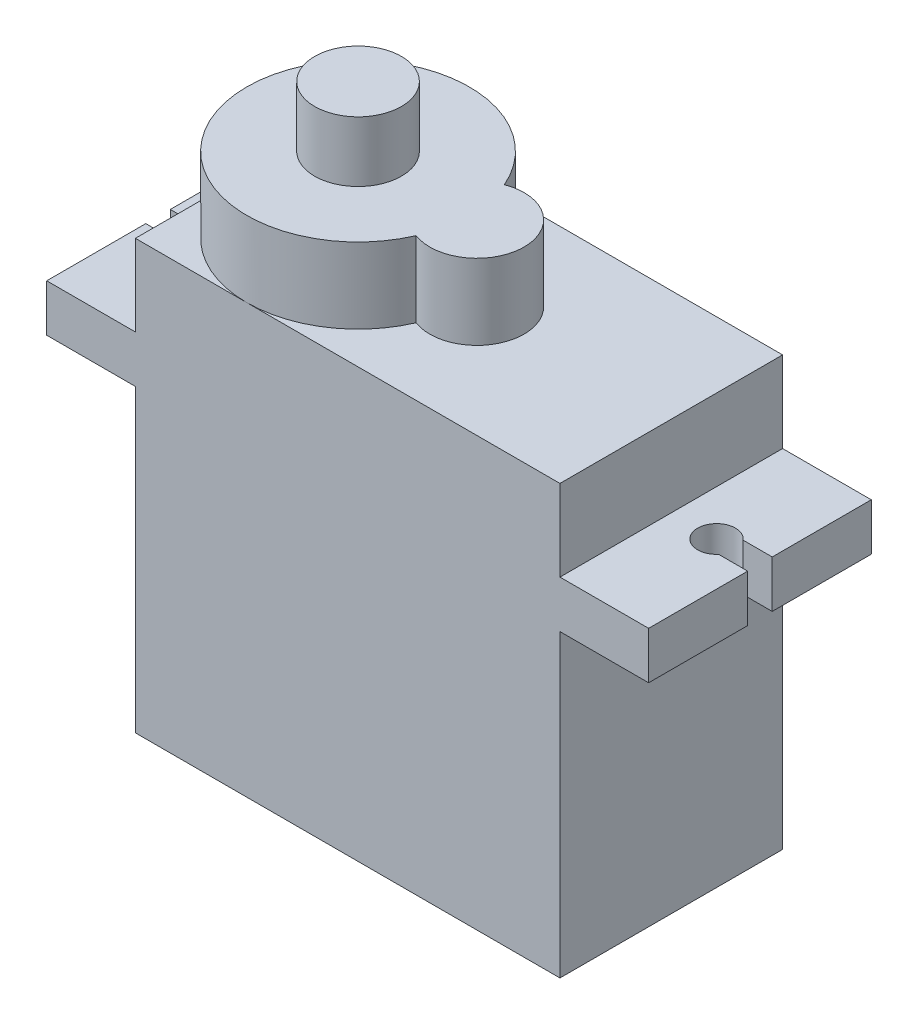
ISO-10303-21;
HEADER;
FILE_DESCRIPTION(('STEP AP214'),'2;1');
FILE_NAME('part.step','',(''),(''),'','','');
FILE_SCHEMA(('AUTOMOTIVE_DESIGN { 1 0 10303 214 1 1 1 1 }'));
ENDSEC;
DATA;
#1=APPLICATION_CONTEXT('core data for automotive mechanical design processes');
#2=APPLICATION_PROTOCOL_DEFINITION('international standard','automotive_design',2000,#1);
#3=PRODUCT_CONTEXT('',#1,'mechanical');
#4=PRODUCT('Part','Part','',(#3));
#5=PRODUCT_RELATED_PRODUCT_CATEGORY('part','',(#4));
#6=PRODUCT_DEFINITION_FORMATION('','',#4);
#7=PRODUCT_DEFINITION_CONTEXT('part definition',#1,'design');
#8=PRODUCT_DEFINITION('design','',#6,#7);
#9=PRODUCT_DEFINITION_SHAPE('','',#8);
#10=(LENGTH_UNIT() NAMED_UNIT(*) SI_UNIT(.MILLI.,.METRE.));
#11=(NAMED_UNIT(*) PLANE_ANGLE_UNIT() SI_UNIT($,.RADIAN.));
#12=(NAMED_UNIT(*) SI_UNIT($,.STERADIAN.) SOLID_ANGLE_UNIT());
#13=UNCERTAINTY_MEASURE_WITH_UNIT(LENGTH_MEASURE(1.E-05),#10,'distance_accuracy_value','');
#14=(GEOMETRIC_REPRESENTATION_CONTEXT(3) GLOBAL_UNCERTAINTY_ASSIGNED_CONTEXT((#13)) GLOBAL_UNIT_ASSIGNED_CONTEXT((#10,
#11,#12)) REPRESENTATION_CONTEXT('',''));
#15=CARTESIAN_POINT('',(0.,0.,0.));
#16=DIRECTION('',(0.,0.,1.));
#17=DIRECTION('',(1.,0.,0.));
#18=AXIS2_PLACEMENT_3D('',#15,#16,#17);
#19=CARTESIAN_POINT('',(0.,22.7,0.));
#20=DIRECTION('',(0.,1.,0.));
#21=DIRECTION('',(0.,0.,1.));
#22=AXIS2_PLACEMENT_3D('',#19,#20,#21);
#23=PLANE('',#22);
#24=CARTESIAN_POINT('',(-5.35000000000001,22.7,0.));
#25=DIRECTION('',(0.,1.,0.));
#26=DIRECTION('',(0.,0.,1.));
#27=AXIS2_PLACEMENT_3D('',#24,#25,#26);
#28=CIRCLE('',#27,5.9);
#29=CARTESIAN_POINT('',(0.0666666666666628,22.7,-2.33874372735069));
#30=VERTEX_POINT('',#29);
#31=CARTESIAN_POINT('',(-5.35000000000001,22.7,-5.9));
#32=VERTEX_POINT('',#31);
#33=EDGE_CURVE('E50',#30,#32,#28,.T.);
#34=ORIENTED_EDGE('',*,*,#33,.F.);
#35=CARTESIAN_POINT('',(0.949999999999995,22.7,0.));
#36=DIRECTION('',(0.,1.,0.));
#37=DIRECTION('',(0.,0.,1.));
#38=AXIS2_PLACEMENT_3D('',#35,#36,#37);
#39=CIRCLE('',#38,2.5);
#40=CARTESIAN_POINT('',(0.0666666666666628,22.7,2.33874372735069));
#41=VERTEX_POINT('',#40);
#42=EDGE_CURVE('E65',#41,#30,#39,.T.);
#43=ORIENTED_EDGE('',*,*,#42,.F.);
#44=CARTESIAN_POINT('',(-5.35000000000001,22.7,5.9));
#45=VERTEX_POINT('',#44);
#46=EDGE_CURVE('E275',#45,#41,#28,.T.);
#47=ORIENTED_EDGE('',*,*,#46,.F.);
#48=DIRECTION('',(1.,0.,0.));
#49=VECTOR('',#48,1.);
#50=CARTESIAN_POINT('',(-11.25,22.7,5.9));
#51=LINE('',#50,#49);
#52=CARTESIAN_POINT('',(11.25,22.7,5.9));
#53=VERTEX_POINT('',#52);
#54=EDGE_CURVE('E385',#45,#53,#51,.T.);
#55=ORIENTED_EDGE('',*,*,#54,.T.);
#56=DIRECTION('',(0.,0.,-1.));
#57=VECTOR('',#56,1.);
#58=CARTESIAN_POINT('',(11.25,22.7,-5.9));
#59=LINE('',#58,#57);
#60=CARTESIAN_POINT('',(11.25,22.7,-5.9));
#61=VERTEX_POINT('',#60);
#62=EDGE_CURVE('E373',#53,#61,#59,.T.);
#63=ORIENTED_EDGE('',*,*,#62,.T.);
#64=DIRECTION('',(-1.,0.,0.));
#65=VECTOR('',#64,1.);
#66=CARTESIAN_POINT('',(-11.25,22.7,-5.9));
#67=LINE('',#66,#65);
#68=EDGE_CURVE('E378',#61,#32,#67,.T.);
#69=ORIENTED_EDGE('',*,*,#68,.T.);
#70=EDGE_LOOP('',(#34,#43,#47,#55,#63,#69));
#71=FACE_BOUND('',#70,.T.);
#72=ADVANCED_FACE('F39',(#71),#23,.T.);
#73=CARTESIAN_POINT('',(-11.25,22.7,0.));
#74=VERTEX_POINT('',#73);
#75=EDGE_CURVE('E11',#32,#74,#28,.T.);
#76=ORIENTED_EDGE('',*,*,#75,.F.);
#77=CARTESIAN_POINT('',(-11.25,22.7,-5.9));
#78=VERTEX_POINT('',#77);
#79=EDGE_CURVE('E376',#32,#78,#67,.T.);
#80=ORIENTED_EDGE('',*,*,#79,.T.);
#81=DIRECTION('',(0.,0.,1.));
#82=VECTOR('',#81,1.);
#83=CARTESIAN_POINT('',(-11.25,22.7,-5.9));
#84=LINE('',#83,#82);
#85=EDGE_CURVE('E382',#78,#74,#84,.T.);
#86=ORIENTED_EDGE('',*,*,#85,.T.);
#87=EDGE_LOOP('',(#76,#80,#86));
#88=FACE_BOUND('',#87,.T.);
#89=ADVANCED_FACE('F442',(#88),#23,.T.);
#90=CARTESIAN_POINT('',(-15.95,18.4,-5.9));
#91=DIRECTION('',(1.,0.,0.));
#92=DIRECTION('',(0.,0.,-1.));
#93=AXIS2_PLACEMENT_3D('',#90,#91,#92);
#94=PLANE('',#93);
#95=DIRECTION('',(0.,1.,0.));
#96=VECTOR('',#95,1.);
#97=CARTESIAN_POINT('',(-15.95,0.,-0.65));
#98=LINE('',#97,#96);
#99=CARTESIAN_POINT('',(-15.95,15.9,-0.65));
#100=VERTEX_POINT('',#99);
#101=CARTESIAN_POINT('',(-15.95,18.4,-0.65));
#102=VERTEX_POINT('',#101);
#103=EDGE_CURVE('E297',#100,#102,#98,.T.);
#104=ORIENTED_EDGE('',*,*,#103,.T.);
#105=DIRECTION('',(0.,0.,1.));
#106=VECTOR('',#105,1.);
#107=CARTESIAN_POINT('',(-15.95,18.4,-5.9));
#108=LINE('',#107,#106);
#109=CARTESIAN_POINT('',(-15.95,18.4,-5.9));
#110=VERTEX_POINT('',#109);
#111=EDGE_CURVE('E328',#110,#102,#108,.T.);
#112=ORIENTED_EDGE('',*,*,#111,.F.);
#113=DIRECTION('',(0.,-1.,0.));
#114=VECTOR('',#113,1.);
#115=CARTESIAN_POINT('',(-15.95,18.4,-5.9));
#116=LINE('',#115,#114);
#117=CARTESIAN_POINT('',(-15.95,15.9,-5.9));
#118=VERTEX_POINT('',#117);
#119=EDGE_CURVE('E356',#110,#118,#116,.T.);
#120=ORIENTED_EDGE('',*,*,#119,.T.);
#121=DIRECTION('',(0.,0.,1.));
#122=VECTOR('',#121,1.);
#123=CARTESIAN_POINT('',(-15.95,15.9,-5.9));
#124=LINE('',#123,#122);
#125=EDGE_CURVE('E344',#118,#100,#124,.T.);
#126=ORIENTED_EDGE('',*,*,#125,.T.);
#127=EDGE_LOOP('',(#104,#112,#120,#126));
#128=FACE_BOUND('',#127,.T.);
#129=ADVANCED_FACE('F496',(#128),#94,.F.);
#130=CARTESIAN_POINT('',(15.95,18.4,-5.9));
#131=DIRECTION('',(-1.,0.,0.));
#132=DIRECTION('',(0.,0.,1.));
#133=AXIS2_PLACEMENT_3D('',#130,#131,#132);
#134=PLANE('',#133);
#135=DIRECTION('',(0.,-1.,0.));
#136=VECTOR('',#135,1.);
#137=CARTESIAN_POINT('',(15.95,18.4,0.650000000000019));
#138=LINE('',#137,#136);
#139=CARTESIAN_POINT('',(15.95,18.4,0.650000000000018));
#140=VERTEX_POINT('',#139);
#141=CARTESIAN_POINT('',(15.95,15.9,0.650000000000018));
#142=VERTEX_POINT('',#141);
#143=EDGE_CURVE('E413',#140,#142,#138,.T.);
#144=ORIENTED_EDGE('',*,*,#143,.F.);
#145=DIRECTION('',(0.,0.,-1.));
#146=VECTOR('',#145,1.);
#147=CARTESIAN_POINT('',(15.95,18.4,-5.9));
#148=LINE('',#147,#146);
#149=CARTESIAN_POINT('',(15.95,18.4,5.9));
#150=VERTEX_POINT('',#149);
#151=EDGE_CURVE('E319',#150,#140,#148,.T.);
#152=ORIENTED_EDGE('',*,*,#151,.F.);
#153=DIRECTION('',(0.,-1.,0.));
#154=VECTOR('',#153,1.);
#155=CARTESIAN_POINT('',(15.95,18.4,5.9));
#156=LINE('',#155,#154);
#157=CARTESIAN_POINT('',(15.95,15.9,5.9));
#158=VERTEX_POINT('',#157);
#159=EDGE_CURVE('E335',#150,#158,#156,.T.);
#160=ORIENTED_EDGE('',*,*,#159,.T.);
#161=DIRECTION('',(0.,0.,-1.));
#162=VECTOR('',#161,1.);
#163=CARTESIAN_POINT('',(15.95,15.9,-5.9));
#164=LINE('',#163,#162);
#165=EDGE_CURVE('E336',#158,#142,#164,.T.);
#166=ORIENTED_EDGE('',*,*,#165,.T.);
#167=EDGE_LOOP('',(#144,#152,#160,#166));
#168=FACE_BOUND('',#167,.T.);
#169=ADVANCED_FACE('F519',(#168),#134,.F.);
#170=CARTESIAN_POINT('',(11.25,22.7,-5.9));
#171=DIRECTION('',(-1.,0.,0.));
#172=DIRECTION('',(0.,0.,1.));
#173=AXIS2_PLACEMENT_3D('',#170,#171,#172);
#174=PLANE('',#173);
#175=DIRECTION('',(0.,0.,-1.));
#176=VECTOR('',#175,1.);
#177=CARTESIAN_POINT('',(11.25,15.9,-5.9));
#178=LINE('',#177,#176);
#179=CARTESIAN_POINT('',(11.25,15.9,5.9));
#180=VERTEX_POINT('',#179);
#181=CARTESIAN_POINT('',(11.25,15.9,-5.9));
#182=VERTEX_POINT('',#181);
#183=EDGE_CURVE('E365',#180,#182,#178,.T.);
#184=ORIENTED_EDGE('',*,*,#183,.F.);
#185=DIRECTION('',(0.,-1.,0.));
#186=VECTOR('',#185,1.);
#187=CARTESIAN_POINT('',(11.25,22.7,5.9));
#188=LINE('',#187,#186);
#189=CARTESIAN_POINT('',(11.25,0.,5.9));
#190=VERTEX_POINT('',#189);
#191=EDGE_CURVE('E389',#180,#190,#188,.T.);
#192=ORIENTED_EDGE('',*,*,#191,.T.);
#193=DIRECTION('',(0.,0.,-1.));
#194=VECTOR('',#193,1.);
#195=CARTESIAN_POINT('',(11.25,0.,-5.9));
#196=LINE('',#195,#194);
#197=CARTESIAN_POINT('',(11.25,0.,-5.9));
#198=VERTEX_POINT('',#197);
#199=EDGE_CURVE('E372',#190,#198,#196,.T.);
#200=ORIENTED_EDGE('',*,*,#199,.T.);
#201=DIRECTION('',(0.,-1.,0.));
#202=VECTOR('',#201,1.);
#203=CARTESIAN_POINT('',(11.25,22.7,-5.9));
#204=LINE('',#203,#202);
#205=EDGE_CURVE('E409',#182,#198,#204,.T.);
#206=ORIENTED_EDGE('',*,*,#205,.F.);
#207=EDGE_LOOP('',(#184,#192,#200,#206));
#208=FACE_BOUND('',#207,.T.);
#209=ADVANCED_FACE('F483',(#208),#174,.F.);
#210=CARTESIAN_POINT('',(-11.25,22.7,-5.9));
#211=DIRECTION('',(1.,0.,0.));
#212=DIRECTION('',(0.,0.,-1.));
#213=AXIS2_PLACEMENT_3D('',#210,#211,#212);
#214=PLANE('',#213);
#215=DIRECTION('',(0.,0.,-1.));
#216=VECTOR('',#215,1.);
#217=CARTESIAN_POINT('',(-11.25,5.7,-1.8));
#218=LINE('',#217,#216);
#219=CARTESIAN_POINT('',(-11.25,5.7,1.8));
#220=VERTEX_POINT('',#219);
#221=CARTESIAN_POINT('',(-11.25,5.7,-1.8));
#222=VERTEX_POINT('',#221);
#223=EDGE_CURVE('E253',#220,#222,#218,.T.);
#224=ORIENTED_EDGE('',*,*,#223,.F.);
#225=DIRECTION('',(0.,1.,0.));
#226=VECTOR('',#225,1.);
#227=CARTESIAN_POINT('',(-11.25,5.7,1.8));
#228=LINE('',#227,#226);
#229=CARTESIAN_POINT('',(-11.25,4.5,1.8));
#230=VERTEX_POINT('',#229);
#231=EDGE_CURVE('E57',#230,#220,#228,.T.);
#232=ORIENTED_EDGE('',*,*,#231,.F.);
#233=DIRECTION('',(0.,0.,1.));
#234=VECTOR('',#233,1.);
#235=CARTESIAN_POINT('',(-11.25,4.5,-1.8));
#236=LINE('',#235,#234);
#237=CARTESIAN_POINT('',(-11.25,4.5,-1.8));
#238=VERTEX_POINT('',#237);
#239=EDGE_CURVE('E244',#238,#230,#236,.T.);
#240=ORIENTED_EDGE('',*,*,#239,.F.);
#241=DIRECTION('',(0.,-1.,0.));
#242=VECTOR('',#241,1.);
#243=CARTESIAN_POINT('',(-11.25,5.7,-1.8));
#244=LINE('',#243,#242);
#245=EDGE_CURVE('E247',#222,#238,#244,.T.);
#246=ORIENTED_EDGE('',*,*,#245,.F.);
#247=EDGE_LOOP('',(#224,#232,#240,#246));
#248=FACE_BOUND('',#247,.T.);
#249=DIRECTION('',(0.,0.,1.));
#250=VECTOR('',#249,1.);
#251=CARTESIAN_POINT('',(-11.25,15.9,-5.9));
#252=LINE('',#251,#250);
#253=CARTESIAN_POINT('',(-11.25,15.9,-5.9));
#254=VERTEX_POINT('',#253);
#255=CARTESIAN_POINT('',(-11.25,15.9,5.9));
#256=VERTEX_POINT('',#255);
#257=EDGE_CURVE('E362',#254,#256,#252,.T.);
#258=ORIENTED_EDGE('',*,*,#257,.F.);
#259=DIRECTION('',(0.,-1.,0.));
#260=VECTOR('',#259,1.);
#261=CARTESIAN_POINT('',(-11.25,22.7,-5.9));
#262=LINE('',#261,#260);
#263=CARTESIAN_POINT('',(-11.25,0.,-5.9));
#264=VERTEX_POINT('',#263);
#265=EDGE_CURVE('E406',#254,#264,#262,.T.);
#266=ORIENTED_EDGE('',*,*,#265,.T.);
#267=DIRECTION('',(0.,0.,1.));
#268=VECTOR('',#267,1.);
#269=CARTESIAN_POINT('',(-11.25,0.,-5.9));
#270=LINE('',#269,#268);
#271=CARTESIAN_POINT('',(-11.25,0.,5.9));
#272=VERTEX_POINT('',#271);
#273=EDGE_CURVE('E395',#264,#272,#270,.T.);
#274=ORIENTED_EDGE('',*,*,#273,.T.);
#275=DIRECTION('',(0.,-1.,0.));
#276=VECTOR('',#275,1.);
#277=CARTESIAN_POINT('',(-11.25,22.7,5.9));
#278=LINE('',#277,#276);
#279=EDGE_CURVE('E402',#256,#272,#278,.T.);
#280=ORIENTED_EDGE('',*,*,#279,.F.);
#281=EDGE_LOOP('',(#258,#266,#274,#280));
#282=FACE_BOUND('',#281,.T.);
#283=ADVANCED_FACE('F534',(#248,#282),#214,.F.);
#284=CARTESIAN_POINT('',(11.25,18.4,5.9));
#285=VERTEX_POINT('',#284);
#286=EDGE_CURVE('E400',#53,#285,#188,.T.);
#287=ORIENTED_EDGE('',*,*,#286,.T.);
#288=DIRECTION('',(0.,0.,-1.));
#289=VECTOR('',#288,1.);
#290=CARTESIAN_POINT('',(11.25,18.4,-5.9));
#291=LINE('',#290,#289);
#292=CARTESIAN_POINT('',(11.25,18.4,-5.9));
#293=VERTEX_POINT('',#292);
#294=EDGE_CURVE('E370',#285,#293,#291,.T.);
#295=ORIENTED_EDGE('',*,*,#294,.T.);
#296=EDGE_CURVE('E410',#61,#293,#204,.T.);
#297=ORIENTED_EDGE('',*,*,#296,.F.);
#298=ORIENTED_EDGE('',*,*,#62,.F.);
#299=EDGE_LOOP('',(#287,#295,#297,#298));
#300=FACE_BOUND('',#299,.T.);
#301=ADVANCED_FACE('F41',(#300),#174,.F.);
#302=CARTESIAN_POINT('',(-11.25,22.7,-5.9));
#303=DIRECTION('',(0.,0.,1.));
#304=DIRECTION('',(1.,0.,0.));
#305=AXIS2_PLACEMENT_3D('',#302,#303,#304);
#306=PLANE('',#305);
#307=ORIENTED_EDGE('',*,*,#296,.T.);
#308=DIRECTION('',(-1.,0.,0.));
#309=VECTOR('',#308,1.);
#310=CARTESIAN_POINT('',(-15.95,18.4,-5.9));
#311=LINE('',#310,#309);
#312=CARTESIAN_POINT('',(15.95,18.4,-5.9));
#313=VERTEX_POINT('',#312);
#314=EDGE_CURVE('E324',#313,#293,#311,.T.);
#315=ORIENTED_EDGE('',*,*,#314,.F.);
#316=DIRECTION('',(0.,-1.,0.));
#317=VECTOR('',#316,1.);
#318=CARTESIAN_POINT('',(15.95,18.4,-5.9));
#319=LINE('',#318,#317);
#320=CARTESIAN_POINT('',(15.95,15.9,-5.9));
#321=VERTEX_POINT('',#320);
#322=EDGE_CURVE('E359',#313,#321,#319,.T.);
#323=ORIENTED_EDGE('',*,*,#322,.T.);
#324=DIRECTION('',(-1.,0.,0.));
#325=VECTOR('',#324,1.);
#326=CARTESIAN_POINT('',(-15.95,15.9,-5.9));
#327=LINE('',#326,#325);
#328=EDGE_CURVE('E340',#321,#182,#327,.T.);
#329=ORIENTED_EDGE('',*,*,#328,.T.);
#330=ORIENTED_EDGE('',*,*,#205,.T.);
#331=DIRECTION('',(-1.,0.,0.));
#332=VECTOR('',#331,1.);
#333=CARTESIAN_POINT('',(-11.25,0.,-5.9));
#334=LINE('',#333,#332);
#335=EDGE_CURVE('E392',#198,#264,#334,.T.);
#336=ORIENTED_EDGE('',*,*,#335,.T.);
#337=ORIENTED_EDGE('',*,*,#265,.F.);
#338=EDGE_CURVE('E339',#254,#118,#327,.T.);
#339=ORIENTED_EDGE('',*,*,#338,.T.);
#340=ORIENTED_EDGE('',*,*,#119,.F.);
#341=CARTESIAN_POINT('',(-11.25,18.4,-5.9));
#342=VERTEX_POINT('',#341);
#343=EDGE_CURVE('E322',#342,#110,#311,.T.);
#344=ORIENTED_EDGE('',*,*,#343,.F.);
#345=EDGE_CURVE('E407',#78,#342,#262,.T.);
#346=ORIENTED_EDGE('',*,*,#345,.F.);
#347=ORIENTED_EDGE('',*,*,#79,.F.);
#348=ORIENTED_EDGE('',*,*,#68,.F.);
#349=EDGE_LOOP('',(#307,#315,#323,#329,#330,#336,#337,#339,#340,#344,#346,#347,#348));
#350=FACE_BOUND('',#349,.T.);
#351=ADVANCED_FACE('F447',(#350),#306,.F.);
#352=ORIENTED_EDGE('',*,*,#345,.T.);
#353=DIRECTION('',(0.,0.,1.));
#354=VECTOR('',#353,1.);
#355=CARTESIAN_POINT('',(-11.25,18.4,-5.9));
#356=LINE('',#355,#354);
#357=CARTESIAN_POINT('',(-11.25,18.4,5.9));
#358=VERTEX_POINT('',#357);
#359=EDGE_CURVE('E368',#342,#358,#356,.T.);
#360=ORIENTED_EDGE('',*,*,#359,.T.);
#361=CARTESIAN_POINT('',(-11.25,22.7,5.9));
#362=VERTEX_POINT('',#361);
#363=EDGE_CURVE('E403',#362,#358,#278,.T.);
#364=ORIENTED_EDGE('',*,*,#363,.F.);
#365=EDGE_CURVE('E381',#74,#362,#84,.T.);
#366=ORIENTED_EDGE('',*,*,#365,.F.);
#367=ORIENTED_EDGE('',*,*,#85,.F.);
#368=EDGE_LOOP('',(#352,#360,#364,#366,#367));
#369=FACE_BOUND('',#368,.T.);
#370=ADVANCED_FACE('F440',(#369),#214,.F.);
#371=CARTESIAN_POINT('',(-11.25,22.7,5.9));
#372=DIRECTION('',(0.,0.,-1.));
#373=DIRECTION('',(-1.,0.,0.));
#374=AXIS2_PLACEMENT_3D('',#371,#372,#373);
#375=PLANE('',#374);
#376=ORIENTED_EDGE('',*,*,#363,.T.);
#377=DIRECTION('',(1.,0.,0.));
#378=VECTOR('',#377,1.);
#379=CARTESIAN_POINT('',(-15.95,18.4,5.9));
#380=LINE('',#379,#378);
#381=CARTESIAN_POINT('',(-15.95,18.4,5.9));
#382=VERTEX_POINT('',#381);
#383=EDGE_CURVE('E332',#382,#358,#380,.T.);
#384=ORIENTED_EDGE('',*,*,#383,.F.);
#385=DIRECTION('',(0.,-1.,0.));
#386=VECTOR('',#385,1.);
#387=CARTESIAN_POINT('',(-15.95,18.4,5.9));
#388=LINE('',#387,#386);
#389=CARTESIAN_POINT('',(-15.95,15.9,5.9));
#390=VERTEX_POINT('',#389);
#391=EDGE_CURVE('E353',#382,#390,#388,.T.);
#392=ORIENTED_EDGE('',*,*,#391,.T.);
#393=DIRECTION('',(1.,0.,0.));
#394=VECTOR('',#393,1.);
#395=CARTESIAN_POINT('',(-15.95,15.9,5.9));
#396=LINE('',#395,#394);
#397=EDGE_CURVE('E348',#390,#256,#396,.T.);
#398=ORIENTED_EDGE('',*,*,#397,.T.);
#399=ORIENTED_EDGE('',*,*,#279,.T.);
#400=DIRECTION('',(1.,0.,0.));
#401=VECTOR('',#400,1.);
#402=CARTESIAN_POINT('',(-11.25,0.,5.9));
#403=LINE('',#402,#401);
#404=EDGE_CURVE('E377',#272,#190,#403,.T.);
#405=ORIENTED_EDGE('',*,*,#404,.T.);
#406=ORIENTED_EDGE('',*,*,#191,.F.);
#407=EDGE_CURVE('E347',#180,#158,#396,.T.);
#408=ORIENTED_EDGE('',*,*,#407,.T.);
#409=ORIENTED_EDGE('',*,*,#159,.F.);
#410=EDGE_CURVE('E331',#285,#150,#380,.T.);
#411=ORIENTED_EDGE('',*,*,#410,.F.);
#412=ORIENTED_EDGE('',*,*,#286,.F.);
#413=ORIENTED_EDGE('',*,*,#54,.F.);
#414=EDGE_CURVE('E386',#362,#45,#51,.T.);
#415=ORIENTED_EDGE('',*,*,#414,.F.);
#416=EDGE_LOOP('',(#376,#384,#392,#398,#399,#405,#406,#408,#409,#411,#412,#413,#415));
#417=FACE_BOUND('',#416,.T.);
#418=ADVANCED_FACE('F457',(#417),#375,.F.);
#419=EDGE_CURVE('E48',#74,#45,#28,.T.);
#420=ORIENTED_EDGE('',*,*,#419,.F.);
#421=ORIENTED_EDGE('',*,*,#365,.T.);
#422=ORIENTED_EDGE('',*,*,#414,.T.);
#423=EDGE_LOOP('',(#420,#421,#422));
#424=FACE_BOUND('',#423,.T.);
#425=ADVANCED_FACE('F435',(#424),#23,.T.);
#426=CARTESIAN_POINT('',(0.,0.,0.));
#427=DIRECTION('',(0.,1.,0.));
#428=DIRECTION('',(0.,0.,1.));
#429=AXIS2_PLACEMENT_3D('',#426,#427,#428);
#430=PLANE('',#429);
#431=ORIENTED_EDGE('',*,*,#199,.F.);
#432=ORIENTED_EDGE('',*,*,#404,.F.);
#433=ORIENTED_EDGE('',*,*,#273,.F.);
#434=ORIENTED_EDGE('',*,*,#335,.F.);
#435=EDGE_LOOP('',(#431,#432,#433,#434));
#436=FACE_BOUND('',#435,.T.);
#437=ADVANCED_FACE('F489',(#436),#430,.F.);
#438=CARTESIAN_POINT('',(-15.95,18.4,0.65));
#439=VERTEX_POINT('',#438);
#440=EDGE_CURVE('E327',#439,#382,#108,.T.);
#441=ORIENTED_EDGE('',*,*,#440,.F.);
#442=DIRECTION('',(0.,1.,0.));
#443=VECTOR('',#442,1.);
#444=CARTESIAN_POINT('',(-15.95,0.,0.65));
#445=LINE('',#444,#443);
#446=CARTESIAN_POINT('',(-15.95,15.9,0.65));
#447=VERTEX_POINT('',#446);
#448=EDGE_CURVE('E294',#447,#439,#445,.T.);
#449=ORIENTED_EDGE('',*,*,#448,.F.);
#450=EDGE_CURVE('E343',#447,#390,#124,.T.);
#451=ORIENTED_EDGE('',*,*,#450,.T.);
#452=ORIENTED_EDGE('',*,*,#391,.F.);
#453=EDGE_LOOP('',(#441,#449,#451,#452));
#454=FACE_BOUND('',#453,.T.);
#455=ADVANCED_FACE('F507',(#454),#94,.F.);
#456=CARTESIAN_POINT('',(0.,18.4,0.));
#457=DIRECTION('',(0.,1.,0.));
#458=DIRECTION('',(0.,0.,1.));
#459=AXIS2_PLACEMENT_3D('',#456,#457,#458);
#460=PLANE('',#459);
#461=DIRECTION('',(1.,0.,0.));
#462=VECTOR('',#461,1.);
#463=CARTESIAN_POINT('',(0.,18.4,0.65));
#464=LINE('',#463,#462);
#465=CARTESIAN_POINT('',(-14.4099342076785,18.4,0.650000000000001));
#466=VERTEX_POINT('',#465);
#467=EDGE_CURVE('E283',#439,#466,#464,.T.);
#468=ORIENTED_EDGE('',*,*,#467,.F.);
#469=ORIENTED_EDGE('',*,*,#440,.T.);
#470=ORIENTED_EDGE('',*,*,#383,.T.);
#471=ORIENTED_EDGE('',*,*,#359,.F.);
#472=ORIENTED_EDGE('',*,*,#343,.T.);
#473=ORIENTED_EDGE('',*,*,#111,.T.);
#474=DIRECTION('',(1.,0.,0.));
#475=VECTOR('',#474,1.);
#476=CARTESIAN_POINT('',(0.,18.4,-0.650000000000002));
#477=LINE('',#476,#475);
#478=CARTESIAN_POINT('',(-14.4099342076785,18.4,-0.650000000000001));
#479=VERTEX_POINT('',#478);
#480=EDGE_CURVE('E290',#102,#479,#477,.T.);
#481=ORIENTED_EDGE('',*,*,#480,.T.);
#482=CARTESIAN_POINT('',(-13.65,18.4,0.));
#483=DIRECTION('',(0.,1.,0.));
#484=DIRECTION('',(0.,0.,1.));
#485=AXIS2_PLACEMENT_3D('',#482,#483,#484);
#486=CIRCLE('',#485,1.);
#487=EDGE_CURVE('E286',#466,#479,#486,.T.);
#488=ORIENTED_EDGE('',*,*,#487,.F.);
#489=EDGE_LOOP('',(#468,#469,#470,#471,#472,#473,#481,#488));
#490=FACE_BOUND('',#489,.T.);
#491=ADVANCED_FACE('F452',(#490),#460,.T.);
#492=CARTESIAN_POINT('',(0.,15.9,0.));
#493=DIRECTION('',(0.,1.,0.));
#494=DIRECTION('',(0.,0.,1.));
#495=AXIS2_PLACEMENT_3D('',#492,#493,#494);
#496=PLANE('',#495);
#497=ORIENTED_EDGE('',*,*,#450,.F.);
#498=DIRECTION('',(1.,0.,0.));
#499=VECTOR('',#498,1.);
#500=CARTESIAN_POINT('',(0.,15.9,0.65));
#501=LINE('',#500,#499);
#502=CARTESIAN_POINT('',(-14.4099342076785,15.9,0.650000000000001));
#503=VERTEX_POINT('',#502);
#504=EDGE_CURVE('E43',#447,#503,#501,.T.);
#505=ORIENTED_EDGE('',*,*,#504,.T.);
#506=CARTESIAN_POINT('',(-13.65,15.9,0.));
#507=DIRECTION('',(0.,1.,0.));
#508=DIRECTION('',(0.,0.,1.));
#509=AXIS2_PLACEMENT_3D('',#506,#507,#508);
#510=CIRCLE('',#509,1.);
#511=CARTESIAN_POINT('',(-14.4099342076785,15.9,-0.650000000000001));
#512=VERTEX_POINT('',#511);
#513=EDGE_CURVE('E420',#503,#512,#510,.T.);
#514=ORIENTED_EDGE('',*,*,#513,.T.);
#515=DIRECTION('',(1.,0.,0.));
#516=VECTOR('',#515,1.);
#517=CARTESIAN_POINT('',(0.,15.9,-0.650000000000002));
#518=LINE('',#517,#516);
#519=EDGE_CURVE('E422',#100,#512,#518,.T.);
#520=ORIENTED_EDGE('',*,*,#519,.F.);
#521=ORIENTED_EDGE('',*,*,#125,.F.);
#522=ORIENTED_EDGE('',*,*,#338,.F.);
#523=ORIENTED_EDGE('',*,*,#257,.T.);
#524=ORIENTED_EDGE('',*,*,#397,.F.);
#525=EDGE_LOOP('',(#497,#505,#514,#520,#521,#522,#523,#524));
#526=FACE_BOUND('',#525,.T.);
#527=ADVANCED_FACE('F494',(#526),#496,.F.);
#528=DIRECTION('',(-1.,0.,0.));
#529=VECTOR('',#528,1.);
#530=CARTESIAN_POINT('',(0.,18.4,-0.650000000000001));
#531=LINE('',#530,#529);
#532=CARTESIAN_POINT('',(15.95,18.4,-0.649999999999982));
#533=VERTEX_POINT('',#532);
#534=CARTESIAN_POINT('',(14.4099342076785,18.4,-0.649999999999984));
#535=VERTEX_POINT('',#534);
#536=EDGE_CURVE('E308',#533,#535,#531,.T.);
#537=ORIENTED_EDGE('',*,*,#536,.F.);
#538=EDGE_CURVE('E323',#533,#313,#148,.T.);
#539=ORIENTED_EDGE('',*,*,#538,.T.);
#540=ORIENTED_EDGE('',*,*,#314,.T.);
#541=ORIENTED_EDGE('',*,*,#294,.F.);
#542=ORIENTED_EDGE('',*,*,#410,.T.);
#543=ORIENTED_EDGE('',*,*,#151,.T.);
#544=DIRECTION('',(-1.,0.,0.));
#545=VECTOR('',#544,1.);
#546=CARTESIAN_POINT('',(0.,18.4,0.650000000000001));
#547=LINE('',#546,#545);
#548=CARTESIAN_POINT('',(14.4099342076785,18.4,0.650000000000018));
#549=VERTEX_POINT('',#548);
#550=EDGE_CURVE('E305',#140,#549,#547,.T.);
#551=ORIENTED_EDGE('',*,*,#550,.T.);
#552=CARTESIAN_POINT('',(13.65,18.4,0.));
#553=DIRECTION('',(0.,1.,0.));
#554=DIRECTION('',(0.,0.,1.));
#555=AXIS2_PLACEMENT_3D('',#552,#553,#554);
#556=CIRCLE('',#555,1.);
#557=EDGE_CURVE('E282',#549,#535,#556,.F.);
#558=ORIENTED_EDGE('',*,*,#557,.T.);
#559=EDGE_LOOP('',(#537,#539,#540,#541,#542,#543,#551,#558));
#560=FACE_BOUND('',#559,.T.);
#561=ADVANCED_FACE('F470',(#560),#460,.T.);
#562=CARTESIAN_POINT('',(15.95,15.9,-0.649999999999982));
#563=VERTEX_POINT('',#562);
#564=EDGE_CURVE('E318',#563,#321,#164,.T.);
#565=ORIENTED_EDGE('',*,*,#564,.F.);
#566=DIRECTION('',(-1.,0.,0.));
#567=VECTOR('',#566,1.);
#568=CARTESIAN_POINT('',(0.,15.9,-0.650000000000001));
#569=LINE('',#568,#567);
#570=CARTESIAN_POINT('',(14.4099342076785,15.9,-0.649999999999984));
#571=VERTEX_POINT('',#570);
#572=EDGE_CURVE('E315',#563,#571,#569,.T.);
#573=ORIENTED_EDGE('',*,*,#572,.T.);
#574=CARTESIAN_POINT('',(13.65,15.9,0.));
#575=DIRECTION('',(0.,1.,0.));
#576=DIRECTION('',(0.,0.,1.));
#577=AXIS2_PLACEMENT_3D('',#574,#575,#576);
#578=CIRCLE('',#577,1.);
#579=CARTESIAN_POINT('',(14.4099342076785,15.9,0.650000000000018));
#580=VERTEX_POINT('',#579);
#581=EDGE_CURVE('E418',#580,#571,#578,.F.);
#582=ORIENTED_EDGE('',*,*,#581,.F.);
#583=DIRECTION('',(-1.,0.,0.));
#584=VECTOR('',#583,1.);
#585=CARTESIAN_POINT('',(0.,15.9,0.650000000000001));
#586=LINE('',#585,#584);
#587=EDGE_CURVE('E296',#142,#580,#586,.T.);
#588=ORIENTED_EDGE('',*,*,#587,.F.);
#589=ORIENTED_EDGE('',*,*,#165,.F.);
#590=ORIENTED_EDGE('',*,*,#407,.F.);
#591=ORIENTED_EDGE('',*,*,#183,.T.);
#592=ORIENTED_EDGE('',*,*,#328,.F.);
#593=EDGE_LOOP('',(#565,#573,#582,#588,#589,#590,#591,#592));
#594=FACE_BOUND('',#593,.T.);
#595=ADVANCED_FACE('F478',(#594),#496,.F.);
#596=ORIENTED_EDGE('',*,*,#538,.F.);
#597=DIRECTION('',(0.,-1.,0.));
#598=VECTOR('',#597,1.);
#599=CARTESIAN_POINT('',(15.95,18.4,-0.649999999999981));
#600=LINE('',#599,#598);
#601=EDGE_CURVE('E415',#533,#563,#600,.T.);
#602=ORIENTED_EDGE('',*,*,#601,.T.);
#603=ORIENTED_EDGE('',*,*,#564,.T.);
#604=ORIENTED_EDGE('',*,*,#322,.F.);
#605=EDGE_LOOP('',(#596,#602,#603,#604));
#606=FACE_BOUND('',#605,.T.);
#607=ADVANCED_FACE('F473',(#606),#134,.F.);
#608=CARTESIAN_POINT('',(13.65,0.,0.));
#609=DIRECTION('',(0.,1.,0.));
#610=DIRECTION('',(0.,0.,1.));
#611=AXIS2_PLACEMENT_3D('',#608,#609,#610);
#612=CYLINDRICAL_SURFACE('',#611,1.);
#613=ORIENTED_EDGE('',*,*,#581,.T.);
#614=DIRECTION('',(0.,1.,0.));
#615=VECTOR('',#614,1.);
#616=CARTESIAN_POINT('',(14.4099342076785,0.,-0.649999999999984));
#617=LINE('',#616,#615);
#618=EDGE_CURVE('E287',#571,#535,#617,.T.);
#619=ORIENTED_EDGE('',*,*,#618,.T.);
#620=ORIENTED_EDGE('',*,*,#557,.F.);
#621=DIRECTION('',(0.,1.,0.));
#622=VECTOR('',#621,1.);
#623=CARTESIAN_POINT('',(14.4099342076785,0.,0.650000000000018));
#624=LINE('',#623,#622);
#625=EDGE_CURVE('E311',#580,#549,#624,.T.);
#626=ORIENTED_EDGE('',*,*,#625,.F.);
#627=EDGE_LOOP('',(#613,#619,#620,#626));
#628=FACE_BOUND('',#627,.T.);
#629=ADVANCED_FACE('F552',(#628),#612,.F.);
#630=CARTESIAN_POINT('',(0.,0.,-0.650000000000001));
#631=DIRECTION('',(0.,0.,-1.));
#632=DIRECTION('',(-1.,0.,0.));
#633=AXIS2_PLACEMENT_3D('',#630,#631,#632);
#634=PLANE('',#633);
#635=ORIENTED_EDGE('',*,*,#601,.F.);
#636=ORIENTED_EDGE('',*,*,#536,.T.);
#637=ORIENTED_EDGE('',*,*,#618,.F.);
#638=ORIENTED_EDGE('',*,*,#572,.F.);
#639=EDGE_LOOP('',(#635,#636,#637,#638));
#640=FACE_BOUND('',#639,.T.);
#641=ADVANCED_FACE('F557',(#640),#634,.F.);
#642=CARTESIAN_POINT('',(0.,0.,0.650000000000001));
#643=DIRECTION('',(0.,0.,-1.));
#644=DIRECTION('',(-1.,0.,0.));
#645=AXIS2_PLACEMENT_3D('',#642,#643,#644);
#646=PLANE('',#645);
#647=ORIENTED_EDGE('',*,*,#587,.T.);
#648=ORIENTED_EDGE('',*,*,#625,.T.);
#649=ORIENTED_EDGE('',*,*,#550,.F.);
#650=ORIENTED_EDGE('',*,*,#143,.T.);
#651=EDGE_LOOP('',(#647,#648,#649,#650));
#652=FACE_BOUND('',#651,.T.);
#653=ADVANCED_FACE('F590',(#652),#646,.T.);
#654=CARTESIAN_POINT('',(0.,0.,0.65));
#655=DIRECTION('',(0.,0.,1.));
#656=DIRECTION('',(1.,0.,0.));
#657=AXIS2_PLACEMENT_3D('',#654,#655,#656);
#658=PLANE('',#657);
#659=ORIENTED_EDGE('',*,*,#448,.T.);
#660=ORIENTED_EDGE('',*,*,#467,.T.);
#661=DIRECTION('',(0.,1.,0.));
#662=VECTOR('',#661,1.);
#663=CARTESIAN_POINT('',(-14.4099342076785,0.,0.650000000000001));
#664=LINE('',#663,#662);
#665=EDGE_CURVE('E293',#503,#466,#664,.T.);
#666=ORIENTED_EDGE('',*,*,#665,.F.);
#667=ORIENTED_EDGE('',*,*,#504,.F.);
#668=EDGE_LOOP('',(#659,#660,#666,#667));
#669=FACE_BOUND('',#668,.T.);
#670=ADVANCED_FACE('F504',(#669),#658,.F.);
#671=CARTESIAN_POINT('',(0.,0.,-0.650000000000002));
#672=DIRECTION('',(0.,0.,1.));
#673=DIRECTION('',(1.,0.,0.));
#674=AXIS2_PLACEMENT_3D('',#671,#672,#673);
#675=PLANE('',#674);
#676=ORIENTED_EDGE('',*,*,#519,.T.);
#677=DIRECTION('',(0.,1.,0.));
#678=VECTOR('',#677,1.);
#679=CARTESIAN_POINT('',(-14.4099342076785,0.,-0.650000000000001));
#680=LINE('',#679,#678);
#681=EDGE_CURVE('E300',#512,#479,#680,.T.);
#682=ORIENTED_EDGE('',*,*,#681,.T.);
#683=ORIENTED_EDGE('',*,*,#480,.F.);
#684=ORIENTED_EDGE('',*,*,#103,.F.);
#685=EDGE_LOOP('',(#676,#682,#683,#684));
#686=FACE_BOUND('',#685,.T.);
#687=ADVANCED_FACE('F499',(#686),#675,.T.);
#688=CARTESIAN_POINT('',(-13.65,0.,0.));
#689=DIRECTION('',(0.,1.,0.));
#690=DIRECTION('',(0.,0.,1.));
#691=AXIS2_PLACEMENT_3D('',#688,#689,#690);
#692=CYLINDRICAL_SURFACE('',#691,1.);
#693=ORIENTED_EDGE('',*,*,#665,.T.);
#694=ORIENTED_EDGE('',*,*,#487,.T.);
#695=ORIENTED_EDGE('',*,*,#681,.F.);
#696=ORIENTED_EDGE('',*,*,#513,.F.);
#697=EDGE_LOOP('',(#693,#694,#695,#696));
#698=FACE_BOUND('',#697,.T.);
#699=ADVANCED_FACE('F501',(#698),#692,.F.);
#700=CARTESIAN_POINT('',(-5.35000000000001,26.7,0.));
#701=DIRECTION('',(0.,-1.,0.));
#702=DIRECTION('',(0.,0.,-1.));
#703=AXIS2_PLACEMENT_3D('',#700,#701,#702);
#704=CYLINDRICAL_SURFACE('',#703,5.9);
#705=ORIENTED_EDGE('',*,*,#33,.T.);
#706=ORIENTED_EDGE('',*,*,#75,.T.);
#707=ORIENTED_EDGE('',*,*,#419,.T.);
#708=ORIENTED_EDGE('',*,*,#46,.T.);
#709=DIRECTION('',(0.,-1.,0.));
#710=VECTOR('',#709,1.);
#711=CARTESIAN_POINT('',(0.0666666666666628,26.7,2.33874372735069));
#712=LINE('',#711,#710);
#713=CARTESIAN_POINT('',(0.0666666666666628,26.7,2.33874372735069));
#714=VERTEX_POINT('',#713);
#715=EDGE_CURVE('E279',#714,#41,#712,.T.);
#716=ORIENTED_EDGE('',*,*,#715,.F.);
#717=CARTESIAN_POINT('',(-5.35000000000001,26.7,0.));
#718=DIRECTION('',(0.,1.,0.));
#719=DIRECTION('',(0.,0.,1.));
#720=AXIS2_PLACEMENT_3D('',#717,#718,#719);
#721=CIRCLE('',#720,5.9);
#722=CARTESIAN_POINT('',(0.0666666666666628,26.7,-2.33874372735069));
#723=VERTEX_POINT('',#722);
#724=EDGE_CURVE('E265',#723,#714,#721,.T.);
#725=ORIENTED_EDGE('',*,*,#724,.F.);
#726=DIRECTION('',(0.,-1.,0.));
#727=VECTOR('',#726,1.);
#728=CARTESIAN_POINT('',(0.0666666666666628,26.7,-2.33874372735069));
#729=LINE('',#728,#727);
#730=EDGE_CURVE('E272',#723,#30,#729,.T.);
#731=ORIENTED_EDGE('',*,*,#730,.T.);
#732=EDGE_LOOP('',(#705,#706,#707,#708,#716,#725,#731));
#733=FACE_BOUND('',#732,.T.);
#734=ADVANCED_FACE('F432',(#733),#704,.T.);
#735=CARTESIAN_POINT('',(0.949999999999995,26.7,0.));
#736=DIRECTION('',(0.,-1.,0.));
#737=DIRECTION('',(0.,0.,-1.));
#738=AXIS2_PLACEMENT_3D('',#735,#736,#737);
#739=CYLINDRICAL_SURFACE('',#738,2.5);
#740=ORIENTED_EDGE('',*,*,#42,.T.);
#741=ORIENTED_EDGE('',*,*,#730,.F.);
#742=CARTESIAN_POINT('',(0.949999999999995,26.7,0.));
#743=DIRECTION('',(0.,1.,0.));
#744=DIRECTION('',(0.,0.,1.));
#745=AXIS2_PLACEMENT_3D('',#742,#743,#744);
#746=CIRCLE('',#745,2.5);
#747=EDGE_CURVE('E268',#714,#723,#746,.T.);
#748=ORIENTED_EDGE('',*,*,#747,.F.);
#749=ORIENTED_EDGE('',*,*,#715,.T.);
#750=EDGE_LOOP('',(#740,#741,#748,#749));
#751=FACE_BOUND('',#750,.T.);
#752=ADVANCED_FACE('F630',(#751),#739,.T.);
#753=CARTESIAN_POINT('',(0.,26.7,0.));
#754=DIRECTION('',(0.,1.,0.));
#755=DIRECTION('',(0.,0.,1.));
#756=AXIS2_PLACEMENT_3D('',#753,#754,#755);
#757=PLANE('',#756);
#758=ORIENTED_EDGE('',*,*,#724,.T.);
#759=ORIENTED_EDGE('',*,*,#747,.T.);
#760=EDGE_LOOP('',(#758,#759));
#761=FACE_BOUND('',#760,.T.);
#762=CARTESIAN_POINT('',(-5.35000000000001,26.7,0.));
#763=DIRECTION('',(0.,1.,0.));
#764=DIRECTION('',(0.,0.,1.));
#765=AXIS2_PLACEMENT_3D('',#762,#763,#764);
#766=CIRCLE('',#765,2.3);
#767=CARTESIAN_POINT('',(-5.35000000000001,26.7,2.3));
#768=VERTEX_POINT('',#767);
#769=EDGE_CURVE('E270',#768,#768,#766,.T.);
#770=ORIENTED_EDGE('',*,*,#769,.F.);
#771=EDGE_LOOP('',(#770));
#772=FACE_BOUND('',#771,.T.);
#773=ADVANCED_FACE('F639',(#761,#772),#757,.T.);
#774=CARTESIAN_POINT('',(-5.35000000000001,29.9,0.));
#775=DIRECTION('',(0.,-1.,0.));
#776=DIRECTION('',(0.,0.,-1.));
#777=AXIS2_PLACEMENT_3D('',#774,#775,#776);
#778=CYLINDRICAL_SURFACE('',#777,2.3);
#779=ORIENTED_EDGE('',*,*,#769,.T.);
#780=EDGE_LOOP('',(#779));
#781=FACE_BOUND('',#780,.T.);
#782=CARTESIAN_POINT('',(-5.35000000000001,29.9,0.));
#783=DIRECTION('',(0.,1.,0.));
#784=DIRECTION('',(0.,0.,1.));
#785=AXIS2_PLACEMENT_3D('',#782,#783,#784);
#786=CIRCLE('',#785,2.3);
#787=CARTESIAN_POINT('',(-5.35000000000001,29.9,2.3));
#788=VERTEX_POINT('',#787);
#789=EDGE_CURVE('E259',#788,#788,#786,.T.);
#790=ORIENTED_EDGE('',*,*,#789,.F.);
#791=EDGE_LOOP('',(#790));
#792=FACE_BOUND('',#791,.T.);
#793=ADVANCED_FACE('F649',(#781,#792),#778,.T.);
#794=CARTESIAN_POINT('',(0.,29.9,0.));
#795=DIRECTION('',(0.,1.,0.));
#796=DIRECTION('',(0.,0.,1.));
#797=AXIS2_PLACEMENT_3D('',#794,#795,#796);
#798=PLANE('',#797);
#799=ORIENTED_EDGE('',*,*,#789,.T.);
#800=EDGE_LOOP('',(#799));
#801=FACE_BOUND('',#800,.T.);
#802=ADVANCED_FACE('F659',(#801),#798,.T.);
#803=CARTESIAN_POINT('',(-7.25000000000001,5.7,1.8));
#804=DIRECTION('',(0.,0.,1.));
#805=DIRECTION('',(0.,-1.,0.));
#806=AXIS2_PLACEMENT_3D('',#803,#804,#805);
#807=PLANE('',#806);
#808=ORIENTED_EDGE('',*,*,#231,.T.);
#809=DIRECTION('',(-1.,0.,0.));
#810=VECTOR('',#809,1.);
#811=CARTESIAN_POINT('',(-7.25000000000001,5.7,1.8));
#812=LINE('',#811,#810);
#813=CARTESIAN_POINT('',(-7.25000000000001,5.7,1.8));
#814=VERTEX_POINT('',#813);
#815=EDGE_CURVE('E222',#814,#220,#812,.T.);
#816=ORIENTED_EDGE('',*,*,#815,.F.);
#817=DIRECTION('',(0.,1.,0.));
#818=VECTOR('',#817,1.);
#819=CARTESIAN_POINT('',(-7.25000000000001,5.7,1.8));
#820=LINE('',#819,#818);
#821=CARTESIAN_POINT('',(-7.25000000000001,4.5,1.8));
#822=VERTEX_POINT('',#821);
#823=EDGE_CURVE('E226',#822,#814,#820,.T.);
#824=ORIENTED_EDGE('',*,*,#823,.F.);
#825=DIRECTION('',(-1.,0.,0.));
#826=VECTOR('',#825,1.);
#827=CARTESIAN_POINT('',(-7.25000000000001,4.5,1.8));
#828=LINE('',#827,#826);
#829=EDGE_CURVE('E257',#822,#230,#828,.T.);
#830=ORIENTED_EDGE('',*,*,#829,.T.);
#831=EDGE_LOOP('',(#808,#816,#824,#830));
#832=FACE_BOUND('',#831,.T.);
#833=ADVANCED_FACE('F224',(#832),#807,.F.);
#834=CARTESIAN_POINT('',(-7.25000000000001,4.5,-1.8));
#835=DIRECTION('',(0.,-1.,0.));
#836=DIRECTION('',(0.,0.,-1.));
#837=AXIS2_PLACEMENT_3D('',#834,#835,#836);
#838=PLANE('',#837);
#839=ORIENTED_EDGE('',*,*,#239,.T.);
#840=ORIENTED_EDGE('',*,*,#829,.F.);
#841=DIRECTION('',(0.,0.,1.));
#842=VECTOR('',#841,1.);
#843=CARTESIAN_POINT('',(-7.25000000000001,4.5,-1.8));
#844=LINE('',#843,#842);
#845=CARTESIAN_POINT('',(-7.25000000000001,4.5,-1.8));
#846=VERTEX_POINT('',#845);
#847=EDGE_CURVE('E232',#846,#822,#844,.T.);
#848=ORIENTED_EDGE('',*,*,#847,.F.);
#849=DIRECTION('',(-1.,0.,0.));
#850=VECTOR('',#849,1.);
#851=CARTESIAN_POINT('',(-7.25000000000001,4.5,-1.8));
#852=LINE('',#851,#850);
#853=EDGE_CURVE('E260',#846,#238,#852,.T.);
#854=ORIENTED_EDGE('',*,*,#853,.T.);
#855=EDGE_LOOP('',(#839,#840,#848,#854));
#856=FACE_BOUND('',#855,.T.);
#857=ADVANCED_FACE('F688',(#856),#838,.F.);
#858=CARTESIAN_POINT('',(-7.25000000000001,5.7,-1.8));
#859=DIRECTION('',(0.,0.,-1.));
#860=DIRECTION('',(0.,1.,0.));
#861=AXIS2_PLACEMENT_3D('',#858,#859,#860);
#862=PLANE('',#861);
#863=ORIENTED_EDGE('',*,*,#245,.T.);
#864=ORIENTED_EDGE('',*,*,#853,.F.);
#865=DIRECTION('',(0.,-1.,0.));
#866=VECTOR('',#865,1.);
#867=CARTESIAN_POINT('',(-7.25000000000001,5.7,-1.8));
#868=LINE('',#867,#866);
#869=CARTESIAN_POINT('',(-7.25000000000001,5.7,-1.8));
#870=VERTEX_POINT('',#869);
#871=EDGE_CURVE('E240',#870,#846,#868,.T.);
#872=ORIENTED_EDGE('',*,*,#871,.F.);
#873=DIRECTION('',(-1.,0.,0.));
#874=VECTOR('',#873,1.);
#875=CARTESIAN_POINT('',(-7.25000000000001,5.7,-1.8));
#876=LINE('',#875,#874);
#877=EDGE_CURVE('E231',#870,#222,#876,.T.);
#878=ORIENTED_EDGE('',*,*,#877,.T.);
#879=EDGE_LOOP('',(#863,#864,#872,#878));
#880=FACE_BOUND('',#879,.T.);
#881=ADVANCED_FACE('F697',(#880),#862,.F.);
#882=CARTESIAN_POINT('',(-7.25000000000001,5.7,-1.8));
#883=DIRECTION('',(0.,1.,0.));
#884=DIRECTION('',(0.,0.,1.));
#885=AXIS2_PLACEMENT_3D('',#882,#883,#884);
#886=PLANE('',#885);
#887=ORIENTED_EDGE('',*,*,#223,.T.);
#888=ORIENTED_EDGE('',*,*,#877,.F.);
#889=DIRECTION('',(0.,0.,-1.));
#890=VECTOR('',#889,1.);
#891=CARTESIAN_POINT('',(-7.25000000000001,5.7,-1.8));
#892=LINE('',#891,#890);
#893=EDGE_CURVE('E235',#814,#870,#892,.T.);
#894=ORIENTED_EDGE('',*,*,#893,.F.);
#895=ORIENTED_EDGE('',*,*,#815,.T.);
#896=EDGE_LOOP('',(#887,#888,#894,#895));
#897=FACE_BOUND('',#896,.T.);
#898=ADVANCED_FACE('F236',(#897),#886,.F.);
#899=CARTESIAN_POINT('',(-7.25000000000001,0.,0.));
#900=DIRECTION('',(-1.,0.,0.));
#901=DIRECTION('',(0.,0.,1.));
#902=AXIS2_PLACEMENT_3D('',#899,#900,#901);
#903=PLANE('',#902);
#904=ORIENTED_EDGE('',*,*,#823,.T.);
#905=ORIENTED_EDGE('',*,*,#893,.T.);
#906=ORIENTED_EDGE('',*,*,#871,.T.);
#907=ORIENTED_EDGE('',*,*,#847,.T.);
#908=EDGE_LOOP('',(#904,#905,#906,#907));
#909=FACE_BOUND('',#908,.T.);
#910=ADVANCED_FACE('F242',(#909),#903,.T.);
#911=CLOSED_SHELL('',(#72,#89,#129,#169,#209,#283,#301,#351,#370,#418,#425,#437,#455,#491,#527,
#561,#595,#607,#629,#641,#653,#670,#687,#699,#734,#752,#773,#793,#802,#833,#857,#881,#898,#910));
#912=MANIFOLD_SOLID_BREP('B2',#911);
#913=ADVANCED_BREP_SHAPE_REPRESENTATION('',(#18,#912),#14);
#914=SHAPE_DEFINITION_REPRESENTATION(#9,#913);
ENDSEC;
END-ISO-10303-21;
